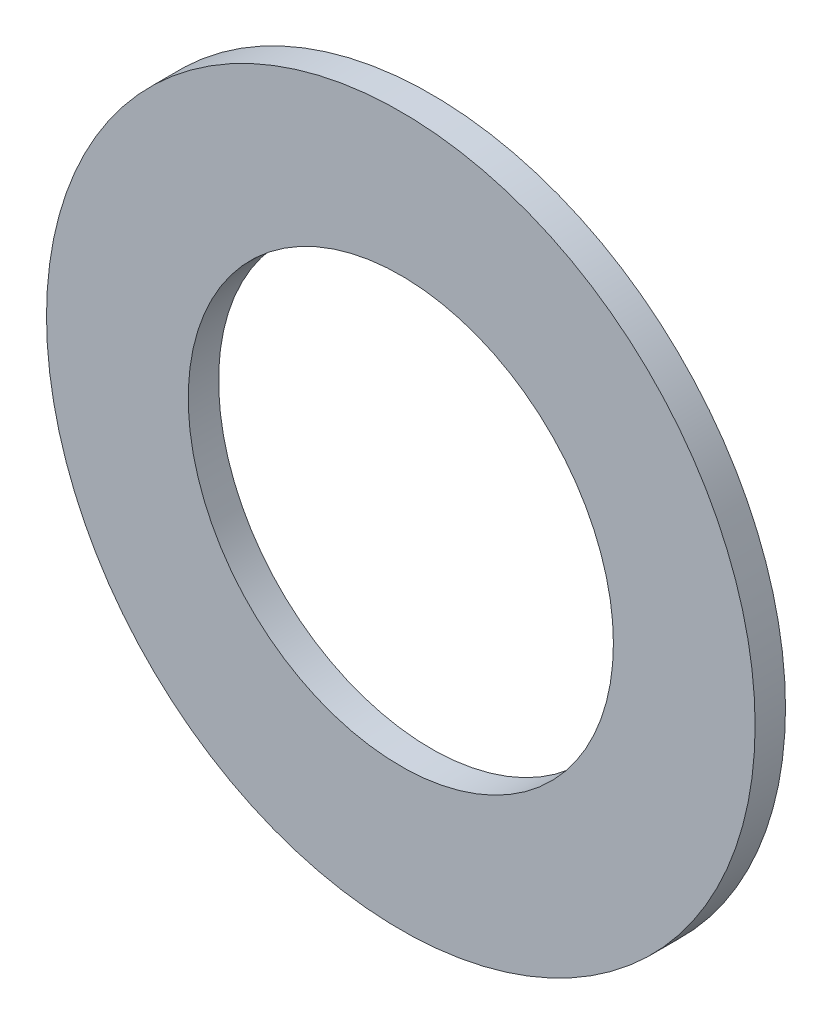
ISO-10303-21;
HEADER;
FILE_DESCRIPTION(('STEP AP214'),'2;1');
FILE_NAME('part.step','',(''),(''),'','','');
FILE_SCHEMA(('AUTOMOTIVE_DESIGN { 1 0 10303 214 1 1 1 1 }'));
ENDSEC;
DATA;
#1=APPLICATION_CONTEXT('core data for automotive mechanical design processes');
#2=APPLICATION_PROTOCOL_DEFINITION('international standard','automotive_design',2000,#1);
#3=PRODUCT_CONTEXT('',#1,'mechanical');
#4=PRODUCT('Part','Part','',(#3));
#5=PRODUCT_RELATED_PRODUCT_CATEGORY('part','',(#4));
#6=PRODUCT_DEFINITION_FORMATION('','',#4);
#7=PRODUCT_DEFINITION_CONTEXT('part definition',#1,'design');
#8=PRODUCT_DEFINITION('design','',#6,#7);
#9=PRODUCT_DEFINITION_SHAPE('','',#8);
#10=(LENGTH_UNIT() NAMED_UNIT(*) SI_UNIT(.MILLI.,.METRE.));
#11=(NAMED_UNIT(*) PLANE_ANGLE_UNIT() SI_UNIT($,.RADIAN.));
#12=(NAMED_UNIT(*) SI_UNIT($,.STERADIAN.) SOLID_ANGLE_UNIT());
#13=UNCERTAINTY_MEASURE_WITH_UNIT(LENGTH_MEASURE(1.E-05),#10,'distance_accuracy_value','');
#14=(GEOMETRIC_REPRESENTATION_CONTEXT(3) GLOBAL_UNCERTAINTY_ASSIGNED_CONTEXT((#13)) GLOBAL_UNIT_ASSIGNED_CONTEXT((#10,
#11,#12)) REPRESENTATION_CONTEXT('',''));
#15=CARTESIAN_POINT('',(0.,0.,0.));
#16=DIRECTION('',(0.,0.,1.));
#17=DIRECTION('',(1.,0.,0.));
#18=AXIS2_PLACEMENT_3D('',#15,#16,#17);
#19=CARTESIAN_POINT('',(0.,0.,0.3));
#20=DIRECTION('',(0.,0.,1.));
#21=DIRECTION('',(1.,0.,0.));
#22=AXIS2_PLACEMENT_3D('',#19,#20,#21);
#23=PLANE('',#22);
#24=CARTESIAN_POINT('',(0.,0.,0.3));
#25=DIRECTION('',(0.,0.,1.));
#26=DIRECTION('',(1.,0.,0.));
#27=AXIS2_PLACEMENT_3D('',#24,#25,#26);
#28=CIRCLE('',#27,3.5);
#29=CARTESIAN_POINT('',(3.5,0.,0.3));
#30=VERTEX_POINT('',#29);
#31=EDGE_CURVE('E10',#30,#30,#28,.T.);
#32=ORIENTED_EDGE('',*,*,#31,.T.);
#33=EDGE_LOOP('',(#32));
#34=FACE_BOUND('',#33,.T.);
#35=CARTESIAN_POINT('',(0.,0.,0.3));
#36=DIRECTION('',(0.,0.,1.));
#37=DIRECTION('',(1.,0.,0.));
#38=AXIS2_PLACEMENT_3D('',#35,#36,#37);
#39=CIRCLE('',#38,2.1);
#40=CARTESIAN_POINT('',(2.1,0.,0.3));
#41=VERTEX_POINT('',#40);
#42=EDGE_CURVE('E50',#41,#41,#39,.T.);
#43=ORIENTED_EDGE('',*,*,#42,.F.);
#44=EDGE_LOOP('',(#43));
#45=FACE_BOUND('',#44,.T.);
#46=ADVANCED_FACE('F37',(#34,#45),#23,.T.);
#47=CARTESIAN_POINT('',(0.,0.,0.));
#48=DIRECTION('',(0.,0.,1.));
#49=DIRECTION('',(1.,0.,0.));
#50=AXIS2_PLACEMENT_3D('',#47,#48,#49);
#51=PLANE('',#50);
#52=CARTESIAN_POINT('',(0.,0.,0.));
#53=DIRECTION('',(0.,0.,1.));
#54=DIRECTION('',(1.,0.,0.));
#55=AXIS2_PLACEMENT_3D('',#52,#53,#54);
#56=CIRCLE('',#55,3.5);
#57=CARTESIAN_POINT('',(3.5,0.,0.));
#58=VERTEX_POINT('',#57);
#59=EDGE_CURVE('E41',#58,#58,#56,.T.);
#60=ORIENTED_EDGE('',*,*,#59,.F.);
#61=EDGE_LOOP('',(#60));
#62=FACE_BOUND('',#61,.T.);
#63=CARTESIAN_POINT('',(0.,0.,0.));
#64=DIRECTION('',(0.,0.,1.));
#65=DIRECTION('',(1.,0.,0.));
#66=AXIS2_PLACEMENT_3D('',#63,#64,#65);
#67=CIRCLE('',#66,2.1);
#68=CARTESIAN_POINT('',(2.1,0.,0.));
#69=VERTEX_POINT('',#68);
#70=EDGE_CURVE('E52',#69,#69,#67,.T.);
#71=ORIENTED_EDGE('',*,*,#70,.T.);
#72=EDGE_LOOP('',(#71));
#73=FACE_BOUND('',#72,.T.);
#74=ADVANCED_FACE('F64',(#62,#73),#51,.F.);
#75=CARTESIAN_POINT('',(0.,0.,0.3));
#76=DIRECTION('',(0.,0.,-1.));
#77=DIRECTION('',(-1.,0.,0.));
#78=AXIS2_PLACEMENT_3D('',#75,#76,#77);
#79=CYLINDRICAL_SURFACE('',#78,3.5);
#80=ORIENTED_EDGE('',*,*,#31,.F.);
#81=EDGE_LOOP('',(#80));
#82=FACE_BOUND('',#81,.T.);
#83=ORIENTED_EDGE('',*,*,#59,.T.);
#84=EDGE_LOOP('',(#83));
#85=FACE_BOUND('',#84,.T.);
#86=ADVANCED_FACE('F39',(#82,#85),#79,.T.);
#87=CARTESIAN_POINT('',(0.,0.,0.3));
#88=DIRECTION('',(0.,0.,-1.));
#89=DIRECTION('',(-1.,0.,0.));
#90=AXIS2_PLACEMENT_3D('',#87,#88,#89);
#91=CYLINDRICAL_SURFACE('',#90,2.1);
#92=ORIENTED_EDGE('',*,*,#42,.T.);
#93=EDGE_LOOP('',(#92));
#94=FACE_BOUND('',#93,.T.);
#95=ORIENTED_EDGE('',*,*,#70,.F.);
#96=EDGE_LOOP('',(#95));
#97=FACE_BOUND('',#96,.T.);
#98=ADVANCED_FACE('F60',(#94,#97),#91,.F.);
#99=CLOSED_SHELL('',(#46,#74,#86,#98));
#100=MANIFOLD_SOLID_BREP('B2',#99);
#101=ADVANCED_BREP_SHAPE_REPRESENTATION('',(#18,#100),#14);
#102=SHAPE_DEFINITION_REPRESENTATION(#9,#101);
ENDSEC;
END-ISO-10303-21;
